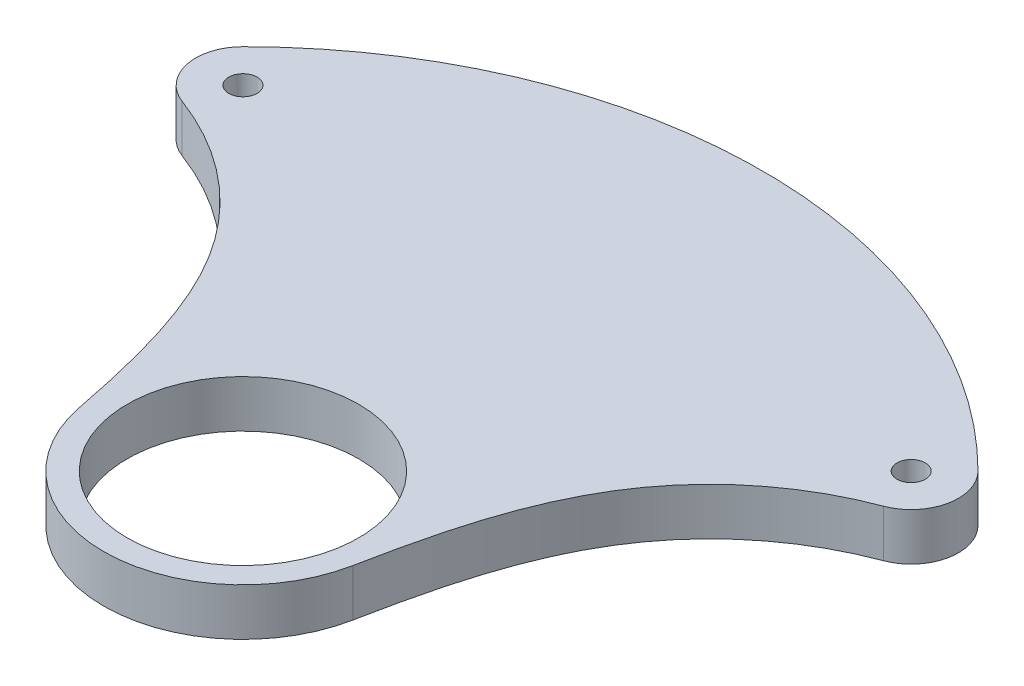
ISO-10303-21;
HEADER;
FILE_DESCRIPTION(('STEP AP214'),'2;1');
FILE_NAME('part.step','',(''),(''),'','','');
FILE_SCHEMA(('AUTOMOTIVE_DESIGN { 1 0 10303 214 1 1 1 1 }'));
ENDSEC;
DATA;
#1=APPLICATION_CONTEXT('core data for automotive mechanical design processes');
#2=APPLICATION_PROTOCOL_DEFINITION('international standard','automotive_design',2000,#1);
#3=PRODUCT_CONTEXT('',#1,'mechanical');
#4=PRODUCT('Part','Part','',(#3));
#5=PRODUCT_RELATED_PRODUCT_CATEGORY('part','',(#4));
#6=PRODUCT_DEFINITION_FORMATION('','',#4);
#7=PRODUCT_DEFINITION_CONTEXT('part definition',#1,'design');
#8=PRODUCT_DEFINITION('design','',#6,#7);
#9=PRODUCT_DEFINITION_SHAPE('','',#8);
#10=(LENGTH_UNIT() NAMED_UNIT(*) SI_UNIT(.MILLI.,.METRE.));
#11=(NAMED_UNIT(*) PLANE_ANGLE_UNIT() SI_UNIT($,.RADIAN.));
#12=(NAMED_UNIT(*) SI_UNIT($,.STERADIAN.) SOLID_ANGLE_UNIT());
#13=UNCERTAINTY_MEASURE_WITH_UNIT(LENGTH_MEASURE(1.E-05),#10,'distance_accuracy_value','');
#14=(GEOMETRIC_REPRESENTATION_CONTEXT(3) GLOBAL_UNCERTAINTY_ASSIGNED_CONTEXT((#13)) GLOBAL_UNIT_ASSIGNED_CONTEXT((#10,
#11,#12)) REPRESENTATION_CONTEXT('',''));
#15=CARTESIAN_POINT('',(0.,0.,0.));
#16=DIRECTION('',(0.,0.,1.));
#17=DIRECTION('',(1.,0.,0.));
#18=AXIS2_PLACEMENT_3D('',#15,#16,#17);
#19=CARTESIAN_POINT('',(35.3553390593274,5.,-35.3553390593273));
#20=DIRECTION('',(0.,-1.,0.));
#21=DIRECTION('',(0.,0.,-1.));
#22=AXIS2_PLACEMENT_3D('',#19,#20,#21);
#23=CYLINDRICAL_SURFACE('',#22,5.);
#24=CARTESIAN_POINT('',(35.3553390593274,0.,-35.3553390593273));
#25=DIRECTION('',(0.,1.,0.));
#26=DIRECTION('',(0.,0.,1.));
#27=AXIS2_PLACEMENT_3D('',#24,#25,#26);
#28=CIRCLE('',#27,5.);
#29=CARTESIAN_POINT('',(38.8908729652602,0.,-38.89087296526));
#30=VERTEX_POINT('',#29);
#31=CARTESIAN_POINT('',(37.1012695198472,0.,-30.6700720629834));
#32=VERTEX_POINT('',#31);
#33=EDGE_CURVE('E282',#30,#32,#28,.F.);
#34=ORIENTED_EDGE('',*,*,#33,.F.);
#35=DIRECTION('',(0.,-1.,0.));
#36=VECTOR('',#35,1.);
#37=CARTESIAN_POINT('',(38.8908729652602,5.,-38.89087296526));
#38=LINE('',#37,#36);
#39=CARTESIAN_POINT('',(38.8908729652602,5.,-38.89087296526));
#40=VERTEX_POINT('',#39);
#41=EDGE_CURVE('E162',#40,#30,#38,.T.);
#42=ORIENTED_EDGE('',*,*,#41,.F.);
#43=CARTESIAN_POINT('',(35.3553390593274,5.,-35.3553390593273));
#44=DIRECTION('',(0.,1.,0.));
#45=DIRECTION('',(0.,0.,1.));
#46=AXIS2_PLACEMENT_3D('',#43,#44,#45);
#47=CIRCLE('',#46,5.);
#48=CARTESIAN_POINT('',(37.1012695198472,5.,-30.6700720629834));
#49=VERTEX_POINT('',#48);
#50=EDGE_CURVE('E235',#40,#49,#47,.F.);
#51=ORIENTED_EDGE('',*,*,#50,.T.);
#52=DIRECTION('',(0.,-1.,0.));
#53=VECTOR('',#52,1.);
#54=CARTESIAN_POINT('',(37.1012695198472,5.,-30.6700720629834));
#55=LINE('',#54,#53);
#56=EDGE_CURVE('E12',#49,#32,#55,.T.);
#57=ORIENTED_EDGE('',*,*,#56,.T.);
#58=EDGE_LOOP('',(#34,#42,#51,#57));
#59=FACE_BOUND('',#58,.T.);
#60=ADVANCED_FACE('F152',(#59),#23,.T.);
#61=CARTESIAN_POINT('',(0.,5.,0.));
#62=DIRECTION('',(0.,-1.,0.));
#63=DIRECTION('',(0.,0.,-1.));
#64=AXIS2_PLACEMENT_3D('',#61,#62,#63);
#65=CYLINDRICAL_SURFACE('',#64,55.);
#66=CARTESIAN_POINT('',(0.,0.,0.));
#67=DIRECTION('',(0.,1.,0.));
#68=DIRECTION('',(0.,0.,1.));
#69=AXIS2_PLACEMENT_3D('',#66,#67,#68);
#70=CIRCLE('',#69,55.);
#71=CARTESIAN_POINT('',(-38.8908729652602,0.,-38.89087296526));
#72=VERTEX_POINT('',#71);
#73=EDGE_CURVE('E286',#30,#72,#70,.T.);
#74=ORIENTED_EDGE('',*,*,#73,.T.);
#75=DIRECTION('',(0.,-1.,0.));
#76=VECTOR('',#75,1.);
#77=CARTESIAN_POINT('',(-38.8908729652602,5.,-38.89087296526));
#78=LINE('',#77,#76);
#79=CARTESIAN_POINT('',(-38.8908729652602,5.,-38.89087296526));
#80=VERTEX_POINT('',#79);
#81=EDGE_CURVE('E220',#80,#72,#78,.T.);
#82=ORIENTED_EDGE('',*,*,#81,.F.);
#83=CARTESIAN_POINT('',(0.,5.,0.));
#84=DIRECTION('',(0.,1.,0.));
#85=DIRECTION('',(0.,0.,1.));
#86=AXIS2_PLACEMENT_3D('',#83,#84,#85);
#87=CIRCLE('',#86,55.);
#88=EDGE_CURVE('E229',#40,#80,#87,.T.);
#89=ORIENTED_EDGE('',*,*,#88,.F.);
#90=ORIENTED_EDGE('',*,*,#41,.T.);
#91=EDGE_LOOP('',(#74,#82,#89,#90));
#92=FACE_BOUND('',#91,.T.);
#93=ADVANCED_FACE('F253',(#92),#65,.T.);
#94=CARTESIAN_POINT('',(-37.1012695198472,5.,-30.6700720629834));
#95=CARTESIAN_POINT('',(-31.0879369971767,5.,-28.4292477025452));
#96=CARTESIAN_POINT('',(-19.5444117508886,5.,-19.3017262070138));
#97=CARTESIAN_POINT('',(-16.0485688950031,5.,-5.16921363176343));
#98=CARTESIAN_POINT('',(-14.4729681854976,5.,2.8452929377439));
#99=B_SPLINE_CURVE_WITH_KNOTS('',3,(#94,#95,#96,#97,#98),.UNSPECIFIED.,.F.,.F.,(4,1,4),(0.,
0.434164211750915,1.),.UNSPECIFIED.);
#100=DIRECTION('',(0.,-1.,0.));
#101=VECTOR('',#100,1.);
#102=SURFACE_OF_LINEAR_EXTRUSION('',#99,#101);
#103=CARTESIAN_POINT('',(-37.1012695198472,0.,-30.6700720629834));
#104=CARTESIAN_POINT('',(-31.0879369971767,0.,-28.4292477025452));
#105=CARTESIAN_POINT('',(-19.5444117508886,0.,-19.3017262070138));
#106=CARTESIAN_POINT('',(-16.0485688950031,0.,-5.16921363176343));
#107=CARTESIAN_POINT('',(-14.4729681854976,0.,2.8452929377439));
#108=B_SPLINE_CURVE_WITH_KNOTS('',3,(#103,#104,#105,#106,#107),.UNSPECIFIED.,.F.,.F.,(4,1,4),
(0.,0.434164211750915,1.),.UNSPECIFIED.);
#109=CARTESIAN_POINT('',(-37.1012695198472,0.,-30.6700720629834));
#110=VERTEX_POINT('',#109);
#111=CARTESIAN_POINT('',(-14.4729681854976,0.,2.84529293774389));
#112=VERTEX_POINT('',#111);
#113=EDGE_CURVE('E270',#110,#112,#108,.T.);
#114=ORIENTED_EDGE('',*,*,#113,.T.);
#115=DIRECTION('',(0.,-1.,0.));
#116=VECTOR('',#115,1.);
#117=CARTESIAN_POINT('',(-14.4729681854976,5.,2.84529293774389));
#118=LINE('',#117,#116);
#119=CARTESIAN_POINT('',(-14.4729681854976,5.,2.84529293774389));
#120=VERTEX_POINT('',#119);
#121=EDGE_CURVE('E190',#120,#112,#118,.T.);
#122=ORIENTED_EDGE('',*,*,#121,.F.);
#123=CARTESIAN_POINT('',(-37.1012695198472,5.,-30.6700720629834));
#124=VERTEX_POINT('',#123);
#125=EDGE_CURVE('E226',#124,#120,#99,.T.);
#126=ORIENTED_EDGE('',*,*,#125,.F.);
#127=DIRECTION('',(0.,-1.,0.));
#128=VECTOR('',#127,1.);
#129=CARTESIAN_POINT('',(-37.1012695198472,5.,-30.6700720629834));
#130=LINE('',#129,#128);
#131=EDGE_CURVE('E209',#124,#110,#130,.T.);
#132=ORIENTED_EDGE('',*,*,#131,.T.);
#133=EDGE_LOOP('',(#114,#122,#126,#132));
#134=FACE_BOUND('',#133,.T.);
#135=ADVANCED_FACE('F232',(#134),#102,.F.);
#136=CARTESIAN_POINT('',(37.1012695198472,5.,-30.6700720629834));
#137=CARTESIAN_POINT('',(31.0879369971767,5.,-28.4292477025452));
#138=CARTESIAN_POINT('',(19.5444117508886,5.,-19.3017262070138));
#139=CARTESIAN_POINT('',(16.0485688950031,5.,-5.16921363176343));
#140=CARTESIAN_POINT('',(14.4729681854976,5.,2.8452929377439));
#141=B_SPLINE_CURVE_WITH_KNOTS('',3,(#136,#137,#138,#139,#140),.UNSPECIFIED.,.F.,.F.,(4,1,4),
(0.,0.434164211750915,1.),.UNSPECIFIED.);
#142=DIRECTION('',(0.,-1.,0.));
#143=VECTOR('',#142,1.);
#144=SURFACE_OF_LINEAR_EXTRUSION('',#141,#143);
#145=CARTESIAN_POINT('',(37.1012695198472,0.,-30.6700720629834));
#146=CARTESIAN_POINT('',(31.0879369971767,0.,-28.4292477025452));
#147=CARTESIAN_POINT('',(19.5444117508886,0.,-19.3017262070138));
#148=CARTESIAN_POINT('',(16.0485688950031,0.,-5.16921363176343));
#149=CARTESIAN_POINT('',(14.4729681854976,0.,2.8452929377439));
#150=B_SPLINE_CURVE_WITH_KNOTS('',3,(#145,#146,#147,#148,#149),.UNSPECIFIED.,.F.,.F.,(4,1,4),
(0.,0.434164211750915,1.),.UNSPECIFIED.);
#151=CARTESIAN_POINT('',(14.4729681854976,0.,2.84529293774389));
#152=VERTEX_POINT('',#151);
#153=EDGE_CURVE('E230',#32,#152,#150,.T.);
#154=ORIENTED_EDGE('',*,*,#153,.F.);
#155=ORIENTED_EDGE('',*,*,#56,.F.);
#156=CARTESIAN_POINT('',(14.4729681854976,5.,2.84529293774389));
#157=VERTEX_POINT('',#156);
#158=EDGE_CURVE('E265',#49,#157,#141,.T.);
#159=ORIENTED_EDGE('',*,*,#158,.T.);
#160=DIRECTION('',(0.,-1.,0.));
#161=VECTOR('',#160,1.);
#162=CARTESIAN_POINT('',(14.4729681854976,5.,2.84529293774389));
#163=LINE('',#162,#161);
#164=EDGE_CURVE('E171',#157,#152,#163,.T.);
#165=ORIENTED_EDGE('',*,*,#164,.T.);
#166=EDGE_LOOP('',(#154,#155,#159,#165));
#167=FACE_BOUND('',#166,.T.);
#168=ADVANCED_FACE('F252',(#167),#144,.T.);
#169=CARTESIAN_POINT('',(0.,0.,0.));
#170=DIRECTION('',(0.,1.,0.));
#171=DIRECTION('',(0.,0.,1.));
#172=AXIS2_PLACEMENT_3D('',#169,#170,#171);
#173=PLANE('',#172);
#174=CARTESIAN_POINT('',(-35.3553390593274,0.,-35.3553390593273));
#175=DIRECTION('',(0.,1.,0.));
#176=DIRECTION('',(0.,0.,1.));
#177=AXIS2_PLACEMENT_3D('',#174,#175,#176);
#178=CIRCLE('',#177,1.5);
#179=CARTESIAN_POINT('',(-35.3553390593274,0.,-33.8553390593273));
#180=VERTEX_POINT('',#179);
#181=EDGE_CURVE('E304',#180,#180,#178,.F.);
#182=ORIENTED_EDGE('',*,*,#181,.F.);
#183=EDGE_LOOP('',(#182));
#184=FACE_BOUND('',#183,.T.);
#185=CARTESIAN_POINT('',(35.3553390593274,0.,-35.3553390593273));
#186=DIRECTION('',(0.,1.,0.));
#187=DIRECTION('',(0.,0.,1.));
#188=AXIS2_PLACEMENT_3D('',#185,#186,#187);
#189=CIRCLE('',#188,1.5);
#190=CARTESIAN_POINT('',(35.3553390593274,0.,-33.8553390593273));
#191=VERTEX_POINT('',#190);
#192=EDGE_CURVE('E337',#191,#191,#189,.F.);
#193=ORIENTED_EDGE('',*,*,#192,.F.);
#194=EDGE_LOOP('',(#193));
#195=FACE_BOUND('',#194,.T.);
#196=CARTESIAN_POINT('',(-35.3553390593274,0.,-35.3553390593273));
#197=DIRECTION('',(0.,1.,0.));
#198=DIRECTION('',(0.,0.,1.));
#199=AXIS2_PLACEMENT_3D('',#196,#197,#198);
#200=CIRCLE('',#199,5.);
#201=EDGE_CURVE('E215',#72,#110,#200,.T.);
#202=ORIENTED_EDGE('',*,*,#201,.F.);
#203=ORIENTED_EDGE('',*,*,#73,.F.);
#204=ORIENTED_EDGE('',*,*,#33,.T.);
#205=ORIENTED_EDGE('',*,*,#153,.T.);
#206=CARTESIAN_POINT('',(0.,0.,0.));
#207=DIRECTION('',(0.,1.,0.));
#208=DIRECTION('',(0.,0.,1.));
#209=AXIS2_PLACEMENT_3D('',#206,#207,#208);
#210=CIRCLE('',#209,14.75);
#211=EDGE_CURVE('E156',#112,#152,#210,.T.);
#212=ORIENTED_EDGE('',*,*,#211,.F.);
#213=ORIENTED_EDGE('',*,*,#113,.F.);
#214=EDGE_LOOP('',(#202,#203,#204,#205,#212,#213));
#215=FACE_BOUND('',#214,.T.);
#216=CARTESIAN_POINT('',(0.,0.,0.));
#217=DIRECTION('',(0.,1.,0.));
#218=DIRECTION('',(0.,0.,1.));
#219=AXIS2_PLACEMENT_3D('',#216,#217,#218);
#220=CIRCLE('',#219,12.25);
#221=CARTESIAN_POINT('',(0.,0.,12.25));
#222=VERTEX_POINT('',#221);
#223=EDGE_CURVE('E302',#222,#222,#220,.T.);
#224=ORIENTED_EDGE('',*,*,#223,.T.);
#225=EDGE_LOOP('',(#224));
#226=FACE_BOUND('',#225,.T.);
#227=ADVANCED_FACE('F254',(#184,#195,#215,#226),#173,.F.);
#228=CARTESIAN_POINT('',(0.,5.,0.));
#229=DIRECTION('',(0.,1.,0.));
#230=DIRECTION('',(0.,0.,1.));
#231=AXIS2_PLACEMENT_3D('',#228,#229,#230);
#232=PLANE('',#231);
#233=CARTESIAN_POINT('',(-35.3553390593274,5.,-35.3553390593273));
#234=DIRECTION('',(0.,1.,0.));
#235=DIRECTION('',(0.,0.,1.));
#236=AXIS2_PLACEMENT_3D('',#233,#234,#235);
#237=CIRCLE('',#236,1.5);
#238=CARTESIAN_POINT('',(-35.3553390593274,5.,-33.8553390593273));
#239=VERTEX_POINT('',#238);
#240=EDGE_CURVE('E332',#239,#239,#237,.T.);
#241=ORIENTED_EDGE('',*,*,#240,.F.);
#242=EDGE_LOOP('',(#241));
#243=FACE_BOUND('',#242,.T.);
#244=CARTESIAN_POINT('',(35.3553390593274,5.,-35.3553390593273));
#245=DIRECTION('',(0.,1.,0.));
#246=DIRECTION('',(0.,0.,-1.));
#247=AXIS2_PLACEMENT_3D('',#244,#245,#246);
#248=CIRCLE('',#247,1.5);
#249=CARTESIAN_POINT('',(35.3553390593274,5.,-36.8553390593273));
#250=VERTEX_POINT('',#249);
#251=EDGE_CURVE('E271',#250,#250,#248,.T.);
#252=ORIENTED_EDGE('',*,*,#251,.F.);
#253=EDGE_LOOP('',(#252));
#254=FACE_BOUND('',#253,.T.);
#255=ORIENTED_EDGE('',*,*,#88,.T.);
#256=CARTESIAN_POINT('',(-35.3553390593274,5.,-35.3553390593273));
#257=DIRECTION('',(0.,1.,0.));
#258=DIRECTION('',(0.,0.,1.));
#259=AXIS2_PLACEMENT_3D('',#256,#257,#258);
#260=CIRCLE('',#259,5.);
#261=EDGE_CURVE('E212',#80,#124,#260,.T.);
#262=ORIENTED_EDGE('',*,*,#261,.T.);
#263=ORIENTED_EDGE('',*,*,#125,.T.);
#264=CARTESIAN_POINT('',(0.,5.,0.));
#265=DIRECTION('',(0.,1.,0.));
#266=DIRECTION('',(0.,0.,1.));
#267=AXIS2_PLACEMENT_3D('',#264,#265,#266);
#268=CIRCLE('',#267,14.75);
#269=EDGE_CURVE('E278',#120,#157,#268,.T.);
#270=ORIENTED_EDGE('',*,*,#269,.T.);
#271=ORIENTED_EDGE('',*,*,#158,.F.);
#272=ORIENTED_EDGE('',*,*,#50,.F.);
#273=EDGE_LOOP('',(#255,#262,#263,#270,#271,#272));
#274=FACE_BOUND('',#273,.T.);
#275=CARTESIAN_POINT('',(0.,5.,0.));
#276=DIRECTION('',(0.,1.,0.));
#277=DIRECTION('',(0.,0.,1.));
#278=AXIS2_PLACEMENT_3D('',#275,#276,#277);
#279=CIRCLE('',#278,12.25);
#280=CARTESIAN_POINT('',(0.,5.,12.25));
#281=VERTEX_POINT('',#280);
#282=EDGE_CURVE('E299',#281,#281,#279,.T.);
#283=ORIENTED_EDGE('',*,*,#282,.F.);
#284=EDGE_LOOP('',(#283));
#285=FACE_BOUND('',#284,.T.);
#286=ADVANCED_FACE('F224',(#243,#254,#274,#285),#232,.T.);
#287=CARTESIAN_POINT('',(0.,5.,0.));
#288=DIRECTION('',(0.,-1.,0.));
#289=DIRECTION('',(0.,0.,-1.));
#290=AXIS2_PLACEMENT_3D('',#287,#288,#289);
#291=CYLINDRICAL_SURFACE('',#290,12.25);
#292=ORIENTED_EDGE('',*,*,#282,.T.);
#293=EDGE_LOOP('',(#292));
#294=FACE_BOUND('',#293,.T.);
#295=ORIENTED_EDGE('',*,*,#223,.F.);
#296=EDGE_LOOP('',(#295));
#297=FACE_BOUND('',#296,.T.);
#298=ADVANCED_FACE('F306',(#294,#297),#291,.F.);
#299=CARTESIAN_POINT('',(0.,5.,0.));
#300=DIRECTION('',(0.,-1.,0.));
#301=DIRECTION('',(0.,0.,-1.));
#302=AXIS2_PLACEMENT_3D('',#299,#300,#301);
#303=CYLINDRICAL_SURFACE('',#302,14.75);
#304=ORIENTED_EDGE('',*,*,#164,.F.);
#305=ORIENTED_EDGE('',*,*,#269,.F.);
#306=ORIENTED_EDGE('',*,*,#121,.T.);
#307=ORIENTED_EDGE('',*,*,#211,.T.);
#308=EDGE_LOOP('',(#304,#305,#306,#307));
#309=FACE_BOUND('',#308,.T.);
#310=ADVANCED_FACE('F154',(#309),#303,.T.);
#311=CARTESIAN_POINT('',(-35.3553390593274,5.,-35.3553390593273));
#312=DIRECTION('',(0.,-1.,0.));
#313=DIRECTION('',(0.,0.,-1.));
#314=AXIS2_PLACEMENT_3D('',#311,#312,#313);
#315=CYLINDRICAL_SURFACE('',#314,5.);
#316=ORIENTED_EDGE('',*,*,#131,.F.);
#317=ORIENTED_EDGE('',*,*,#261,.F.);
#318=ORIENTED_EDGE('',*,*,#81,.T.);
#319=ORIENTED_EDGE('',*,*,#201,.T.);
#320=EDGE_LOOP('',(#316,#317,#318,#319));
#321=FACE_BOUND('',#320,.T.);
#322=ADVANCED_FACE('F211',(#321),#315,.T.);
#323=CARTESIAN_POINT('',(35.3553390593274,-0.00100000000000013,-35.3553390593273));
#324=DIRECTION('',(0.,1.,0.));
#325=DIRECTION('',(0.,0.,1.));
#326=AXIS2_PLACEMENT_3D('',#323,#324,#325);
#327=CYLINDRICAL_SURFACE('',#326,1.5);
#328=ORIENTED_EDGE('',*,*,#251,.T.);
#329=EDGE_LOOP('',(#328));
#330=FACE_BOUND('',#329,.T.);
#331=ORIENTED_EDGE('',*,*,#192,.T.);
#332=EDGE_LOOP('',(#331));
#333=FACE_BOUND('',#332,.T.);
#334=ADVANCED_FACE('F311',(#330,#333),#327,.F.);
#335=CARTESIAN_POINT('',(-35.3553390593274,-0.00100000000000013,-35.3553390593273));
#336=DIRECTION('',(0.,1.,0.));
#337=DIRECTION('',(0.,0.,1.));
#338=AXIS2_PLACEMENT_3D('',#335,#336,#337);
#339=CYLINDRICAL_SURFACE('',#338,1.5);
#340=ORIENTED_EDGE('',*,*,#240,.T.);
#341=EDGE_LOOP('',(#340));
#342=FACE_BOUND('',#341,.T.);
#343=ORIENTED_EDGE('',*,*,#181,.T.);
#344=EDGE_LOOP('',(#343));
#345=FACE_BOUND('',#344,.T.);
#346=ADVANCED_FACE('F324',(#342,#345),#339,.F.);
#347=CLOSED_SHELL('',(#60,#93,#135,#168,#227,#286,#298,#310,#322,#334,#346));
#348=MANIFOLD_SOLID_BREP('B2',#347);
#349=ADVANCED_BREP_SHAPE_REPRESENTATION('',(#18,#348),#14);
#350=SHAPE_DEFINITION_REPRESENTATION(#9,#349);
ENDSEC;
END-ISO-10303-21;
